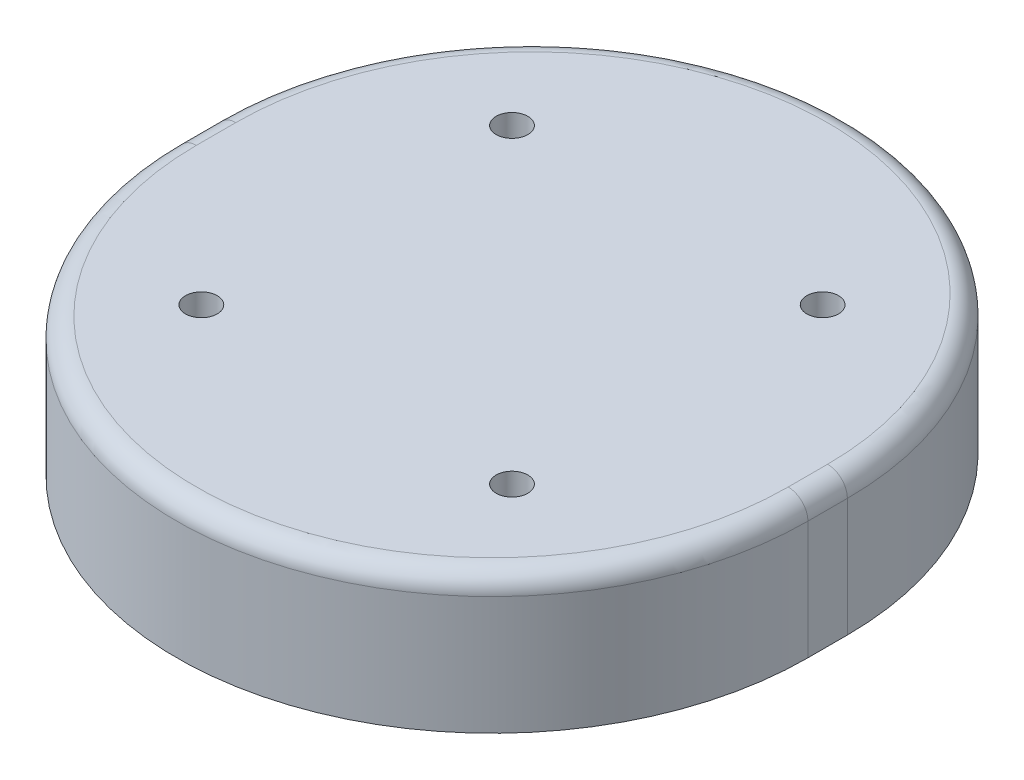
ISO-10303-21;
HEADER;
FILE_DESCRIPTION(('STEP AP214'),'2;1');
FILE_NAME('part.step','',(''),(''),'','','');
FILE_SCHEMA(('AUTOMOTIVE_DESIGN { 1 0 10303 214 1 1 1 1 }'));
ENDSEC;
DATA;
#1=APPLICATION_CONTEXT('core data for automotive mechanical design processes');
#2=APPLICATION_PROTOCOL_DEFINITION('international standard','automotive_design',2000,#1);
#3=PRODUCT_CONTEXT('',#1,'mechanical');
#4=PRODUCT('Part','Part','',(#3));
#5=PRODUCT_RELATED_PRODUCT_CATEGORY('part','',(#4));
#6=PRODUCT_DEFINITION_FORMATION('','',#4);
#7=PRODUCT_DEFINITION_CONTEXT('part definition',#1,'design');
#8=PRODUCT_DEFINITION('design','',#6,#7);
#9=PRODUCT_DEFINITION_SHAPE('','',#8);
#10=(LENGTH_UNIT() NAMED_UNIT(*) SI_UNIT(.MILLI.,.METRE.));
#11=(NAMED_UNIT(*) PLANE_ANGLE_UNIT() SI_UNIT($,.RADIAN.));
#12=(NAMED_UNIT(*) SI_UNIT($,.STERADIAN.) SOLID_ANGLE_UNIT());
#13=UNCERTAINTY_MEASURE_WITH_UNIT(LENGTH_MEASURE(1.E-05),#10,'distance_accuracy_value','');
#14=(GEOMETRIC_REPRESENTATION_CONTEXT(3) GLOBAL_UNCERTAINTY_ASSIGNED_CONTEXT((#13)) GLOBAL_UNIT_ASSIGNED_CONTEXT((#10,
#11,#12)) REPRESENTATION_CONTEXT('',''));
#15=CARTESIAN_POINT('',(0.,0.,0.));
#16=DIRECTION('',(0.,0.,1.));
#17=DIRECTION('',(1.,0.,0.));
#18=AXIS2_PLACEMENT_3D('',#15,#16,#17);
#19=CARTESIAN_POINT('',(0.,22.225,-3.17499999999998));
#20=DIRECTION('',(0.,-1.,0.));
#21=DIRECTION('',(0.,0.,-1.));
#22=AXIS2_PLACEMENT_3D('',#19,#20,#21);
#23=CYLINDRICAL_SURFACE('',#22,50.8);
#24=DIRECTION('',(0.,-1.,0.));
#25=VECTOR('',#24,1.);
#26=CARTESIAN_POINT('',(-50.8,22.225,-3.175));
#27=LINE('',#26,#25);
#28=CARTESIAN_POINT('',(-50.8,19.05,-3.175));
#29=VERTEX_POINT('',#28);
#30=CARTESIAN_POINT('',(-50.8,0.,-3.175));
#31=VERTEX_POINT('',#30);
#32=EDGE_CURVE('E181',#29,#31,#27,.T.);
#33=ORIENTED_EDGE('',*,*,#32,.F.);
#34=CARTESIAN_POINT('',(0.,19.05,-3.17499999999998));
#35=DIRECTION('',(0.,1.,0.));
#36=DIRECTION('',(0.,0.,1.));
#37=AXIS2_PLACEMENT_3D('',#34,#35,#36);
#38=CIRCLE('',#37,50.8);
#39=CARTESIAN_POINT('',(50.8,19.05,-3.175));
#40=VERTEX_POINT('',#39);
#41=EDGE_CURVE('E11',#29,#40,#38,.F.);
#42=ORIENTED_EDGE('',*,*,#41,.T.);
#43=DIRECTION('',(0.,-1.,0.));
#44=VECTOR('',#43,1.);
#45=CARTESIAN_POINT('',(50.8,22.225,-3.175));
#46=LINE('',#45,#44);
#47=CARTESIAN_POINT('',(50.8,0.,-3.175));
#48=VERTEX_POINT('',#47);
#49=EDGE_CURVE('E172',#40,#48,#46,.T.);
#50=ORIENTED_EDGE('',*,*,#49,.T.);
#51=CARTESIAN_POINT('',(0.,0.,-3.17499999999998));
#52=DIRECTION('',(0.,1.,0.));
#53=DIRECTION('',(0.,0.,1.));
#54=AXIS2_PLACEMENT_3D('',#51,#52,#53);
#55=CIRCLE('',#54,50.8);
#56=EDGE_CURVE('E156',#48,#31,#55,.T.);
#57=ORIENTED_EDGE('',*,*,#56,.T.);
#58=EDGE_LOOP('',(#33,#42,#50,#57));
#59=FACE_BOUND('',#58,.T.);
#60=ADVANCED_FACE('F49',(#59),#23,.T.);
#61=CARTESIAN_POINT('',(-50.8,22.225,-3.175));
#62=DIRECTION('',(1.,0.,0.));
#63=DIRECTION('',(0.,0.,-1.));
#64=AXIS2_PLACEMENT_3D('',#61,#62,#63);
#65=PLANE('',#64);
#66=DIRECTION('',(0.,-1.,0.));
#67=VECTOR('',#66,1.);
#68=CARTESIAN_POINT('',(-50.8,22.225,3.17499999999997));
#69=LINE('',#68,#67);
#70=CARTESIAN_POINT('',(-50.8,19.05,3.17499999999997));
#71=VERTEX_POINT('',#70);
#72=CARTESIAN_POINT('',(-50.8,0.,3.17499999999997));
#73=VERTEX_POINT('',#72);
#74=EDGE_CURVE('E178',#71,#73,#69,.T.);
#75=ORIENTED_EDGE('',*,*,#74,.F.);
#76=DIRECTION('',(0.,0.,1.));
#77=VECTOR('',#76,1.);
#78=CARTESIAN_POINT('',(-50.8,19.05,-3.175));
#79=LINE('',#78,#77);
#80=EDGE_CURVE('E59',#71,#29,#79,.F.);
#81=ORIENTED_EDGE('',*,*,#80,.T.);
#82=ORIENTED_EDGE('',*,*,#32,.T.);
#83=DIRECTION('',(0.,0.,1.));
#84=VECTOR('',#83,1.);
#85=CARTESIAN_POINT('',(-50.8,0.,-3.175));
#86=LINE('',#85,#84);
#87=EDGE_CURVE('E160',#31,#73,#86,.T.);
#88=ORIENTED_EDGE('',*,*,#87,.T.);
#89=EDGE_LOOP('',(#75,#81,#82,#88));
#90=FACE_BOUND('',#89,.T.);
#91=ADVANCED_FACE('F273',(#90),#65,.F.);
#92=CARTESIAN_POINT('',(0.,22.225,3.17499999999998));
#93=DIRECTION('',(0.,-1.,0.));
#94=DIRECTION('',(0.,0.,-1.));
#95=AXIS2_PLACEMENT_3D('',#92,#93,#94);
#96=CYLINDRICAL_SURFACE('',#95,50.8);
#97=DIRECTION('',(0.,-1.,0.));
#98=VECTOR('',#97,1.);
#99=CARTESIAN_POINT('',(50.8,22.225,3.175));
#100=LINE('',#99,#98);
#101=CARTESIAN_POINT('',(50.8,19.05,3.175));
#102=VERTEX_POINT('',#101);
#103=CARTESIAN_POINT('',(50.8,0.,3.175));
#104=VERTEX_POINT('',#103);
#105=EDGE_CURVE('E175',#102,#104,#100,.T.);
#106=ORIENTED_EDGE('',*,*,#105,.F.);
#107=CARTESIAN_POINT('',(0.,19.05,3.17499999999998));
#108=DIRECTION('',(0.,1.,0.));
#109=DIRECTION('',(0.,0.,1.));
#110=AXIS2_PLACEMENT_3D('',#107,#108,#109);
#111=CIRCLE('',#110,50.8);
#112=EDGE_CURVE('E74',#102,#71,#111,.F.);
#113=ORIENTED_EDGE('',*,*,#112,.T.);
#114=ORIENTED_EDGE('',*,*,#74,.T.);
#115=CARTESIAN_POINT('',(0.,0.,3.17499999999998));
#116=DIRECTION('',(0.,1.,0.));
#117=DIRECTION('',(0.,0.,1.));
#118=AXIS2_PLACEMENT_3D('',#115,#116,#117);
#119=CIRCLE('',#118,50.8);
#120=EDGE_CURVE('E164',#73,#104,#119,.T.);
#121=ORIENTED_EDGE('',*,*,#120,.T.);
#122=EDGE_LOOP('',(#106,#113,#114,#121));
#123=FACE_BOUND('',#122,.T.);
#124=ADVANCED_FACE('F279',(#123),#96,.T.);
#125=CARTESIAN_POINT('',(50.8,22.225,-3.175));
#126=DIRECTION('',(-1.,0.,0.));
#127=DIRECTION('',(0.,0.,1.));
#128=AXIS2_PLACEMENT_3D('',#125,#126,#127);
#129=PLANE('',#128);
#130=ORIENTED_EDGE('',*,*,#49,.F.);
#131=DIRECTION('',(0.,0.,-1.));
#132=VECTOR('',#131,1.);
#133=CARTESIAN_POINT('',(50.8,19.05,3.175));
#134=LINE('',#133,#132);
#135=EDGE_CURVE('E197',#40,#102,#134,.F.);
#136=ORIENTED_EDGE('',*,*,#135,.T.);
#137=ORIENTED_EDGE('',*,*,#105,.T.);
#138=DIRECTION('',(0.,0.,-1.));
#139=VECTOR('',#138,1.);
#140=CARTESIAN_POINT('',(50.8,0.,-3.175));
#141=LINE('',#140,#139);
#142=EDGE_CURVE('E168',#104,#48,#141,.T.);
#143=ORIENTED_EDGE('',*,*,#142,.T.);
#144=EDGE_LOOP('',(#130,#136,#137,#143));
#145=FACE_BOUND('',#144,.T.);
#146=ADVANCED_FACE('F234',(#145),#129,.F.);
#147=CARTESIAN_POINT('',(0.,22.225,-3.17499999999998));
#148=DIRECTION('',(0.,1.,0.));
#149=DIRECTION('',(0.,0.,1.));
#150=AXIS2_PLACEMENT_3D('',#147,#148,#149);
#151=PLANE('',#150);
#152=CARTESIAN_POINT('',(0.,22.225,3.17499999999998));
#153=DIRECTION('',(0.,1.,0.));
#154=DIRECTION('',(0.,0.,1.));
#155=AXIS2_PLACEMENT_3D('',#152,#153,#154);
#156=CIRCLE('',#155,47.625);
#157=CARTESIAN_POINT('',(-47.625,22.225,3.17499999999997));
#158=VERTEX_POINT('',#157);
#159=CARTESIAN_POINT('',(47.625,22.225,3.175));
#160=VERTEX_POINT('',#159);
#161=EDGE_CURVE('E190',#158,#160,#156,.T.);
#162=ORIENTED_EDGE('',*,*,#161,.T.);
#163=DIRECTION('',(0.,0.,-1.));
#164=VECTOR('',#163,1.);
#165=CARTESIAN_POINT('',(47.625,22.225,-3.175));
#166=LINE('',#165,#164);
#167=CARTESIAN_POINT('',(47.625,22.225,-3.175));
#168=VERTEX_POINT('',#167);
#169=EDGE_CURVE('E193',#160,#168,#166,.T.);
#170=ORIENTED_EDGE('',*,*,#169,.T.);
#171=CARTESIAN_POINT('',(0.,22.225,-3.17499999999998));
#172=DIRECTION('',(0.,1.,0.));
#173=DIRECTION('',(0.,0.,1.));
#174=AXIS2_PLACEMENT_3D('',#171,#172,#173);
#175=CIRCLE('',#174,47.625);
#176=CARTESIAN_POINT('',(-47.625,22.225,-3.175));
#177=VERTEX_POINT('',#176);
#178=EDGE_CURVE('E184',#168,#177,#175,.T.);
#179=ORIENTED_EDGE('',*,*,#178,.T.);
#180=DIRECTION('',(0.,0.,1.));
#181=VECTOR('',#180,1.);
#182=CARTESIAN_POINT('',(-47.625,22.225,3.17499999999997));
#183=LINE('',#182,#181);
#184=EDGE_CURVE('E187',#177,#158,#183,.T.);
#185=ORIENTED_EDGE('',*,*,#184,.T.);
#186=EDGE_LOOP('',(#162,#170,#179,#185));
#187=FACE_BOUND('',#186,.T.);
#188=CARTESIAN_POINT('',(-24.99995,22.225,-24.99995));
#189=DIRECTION('',(0.,1.,0.));
#190=DIRECTION('',(0.,0.,1.));
#191=AXIS2_PLACEMENT_3D('',#188,#189,#190);
#192=CIRCLE('',#191,2.55269999999999);
#193=CARTESIAN_POINT('',(-24.99995,22.225,-22.44725));
#194=VERTEX_POINT('',#193);
#195=EDGE_CURVE('E126',#194,#194,#192,.T.);
#196=ORIENTED_EDGE('',*,*,#195,.F.);
#197=EDGE_LOOP('',(#196));
#198=FACE_BOUND('',#197,.T.);
#199=CARTESIAN_POINT('',(24.99995,22.225,-24.9999500000014));
#200=DIRECTION('',(0.,1.,0.));
#201=DIRECTION('',(0.,0.,1.));
#202=AXIS2_PLACEMENT_3D('',#199,#200,#201);
#203=CIRCLE('',#202,2.55269999999999);
#204=CARTESIAN_POINT('',(24.99995,22.225,-22.4472500000014));
#205=VERTEX_POINT('',#204);
#206=EDGE_CURVE('E125',#205,#205,#203,.T.);
#207=ORIENTED_EDGE('',*,*,#206,.F.);
#208=EDGE_LOOP('',(#207));
#209=FACE_BOUND('',#208,.T.);
#210=CARTESIAN_POINT('',(24.9999500000014,22.225,24.9999499999986));
#211=DIRECTION('',(0.,1.,0.));
#212=DIRECTION('',(0.,0.,1.));
#213=AXIS2_PLACEMENT_3D('',#210,#211,#212);
#214=CIRCLE('',#213,2.55269999999999);
#215=CARTESIAN_POINT('',(24.9999500000014,22.225,27.5526499999986));
#216=VERTEX_POINT('',#215);
#217=EDGE_CURVE('E140',#216,#216,#214,.T.);
#218=ORIENTED_EDGE('',*,*,#217,.F.);
#219=EDGE_LOOP('',(#218));
#220=FACE_BOUND('',#219,.T.);
#221=CARTESIAN_POINT('',(-24.9999499999986,22.225,24.99995));
#222=DIRECTION('',(0.,1.,0.));
#223=DIRECTION('',(0.,0.,1.));
#224=AXIS2_PLACEMENT_3D('',#221,#222,#223);
#225=CIRCLE('',#224,2.55269999999999);
#226=CARTESIAN_POINT('',(-24.9999499999986,22.225,27.55265));
#227=VERTEX_POINT('',#226);
#228=EDGE_CURVE('E148',#227,#227,#225,.T.);
#229=ORIENTED_EDGE('',*,*,#228,.F.);
#230=EDGE_LOOP('',(#229));
#231=FACE_BOUND('',#230,.T.);
#232=ADVANCED_FACE('F241',(#187,#198,#209,#220,#231),#151,.T.);
#233=CARTESIAN_POINT('',(0.,0.,-3.17499999999998));
#234=DIRECTION('',(0.,1.,0.));
#235=DIRECTION('',(0.,0.,1.));
#236=AXIS2_PLACEMENT_3D('',#233,#234,#235);
#237=PLANE('',#236);
#238=ORIENTED_EDGE('',*,*,#56,.F.);
#239=ORIENTED_EDGE('',*,*,#142,.F.);
#240=ORIENTED_EDGE('',*,*,#120,.F.);
#241=ORIENTED_EDGE('',*,*,#87,.F.);
#242=EDGE_LOOP('',(#238,#239,#240,#241));
#243=FACE_BOUND('',#242,.T.);
#244=ADVANCED_FACE('F244',(#243),#237,.F.);
#245=CARTESIAN_POINT('',(-24.9999499999986,9.525,24.99995));
#246=DIRECTION('',(0.,1.,0.));
#247=DIRECTION('',(0.,0.,1.));
#248=AXIS2_PLACEMENT_3D('',#245,#246,#247);
#249=CONICAL_SURFACE('',#248,2.5527,1.02974425867665);
#250=CARTESIAN_POINT('',(-24.9999499999986,7.99118309780835,24.99995));
#251=VERTEX_POINT('',#250);
#252=VERTEX_LOOP('',#251);
#253=FACE_BOUND('',#252,.T.);
#254=CARTESIAN_POINT('',(-24.9999499999986,9.525,24.99995));
#255=DIRECTION('',(0.,1.,0.));
#256=DIRECTION('',(0.,0.,1.));
#257=AXIS2_PLACEMENT_3D('',#254,#255,#256);
#258=CIRCLE('',#257,2.5527);
#259=CARTESIAN_POINT('',(-24.9999499999986,9.525,27.55265));
#260=VERTEX_POINT('',#259);
#261=EDGE_CURVE('E152',#260,#260,#258,.T.);
#262=ORIENTED_EDGE('',*,*,#261,.T.);
#263=EDGE_LOOP('',(#262));
#264=FACE_BOUND('',#263,.T.);
#265=ADVANCED_FACE('F257',(#253,#264),#249,.F.);
#266=CARTESIAN_POINT('',(-24.9999499999986,22.225,24.99995));
#267=DIRECTION('',(0.,1.,0.));
#268=DIRECTION('',(0.,0.,1.));
#269=AXIS2_PLACEMENT_3D('',#266,#267,#268);
#270=CYLINDRICAL_SURFACE('',#269,2.55269999999999);
#271=ORIENTED_EDGE('',*,*,#261,.F.);
#272=EDGE_LOOP('',(#271));
#273=FACE_BOUND('',#272,.T.);
#274=ORIENTED_EDGE('',*,*,#228,.T.);
#275=EDGE_LOOP('',(#274));
#276=FACE_BOUND('',#275,.T.);
#277=ADVANCED_FACE('F254',(#273,#276),#270,.F.);
#278=CARTESIAN_POINT('',(24.9999500000014,9.525,24.9999499999986));
#279=DIRECTION('',(0.,1.,0.));
#280=DIRECTION('',(0.,0.,1.));
#281=AXIS2_PLACEMENT_3D('',#278,#279,#280);
#282=CONICAL_SURFACE('',#281,2.5527,1.02974425867665);
#283=CARTESIAN_POINT('',(24.9999500000014,7.99118309780835,24.9999499999986));
#284=VERTEX_POINT('',#283);
#285=VERTEX_LOOP('',#284);
#286=FACE_BOUND('',#285,.T.);
#287=CARTESIAN_POINT('',(24.9999500000014,9.525,24.9999499999986));
#288=DIRECTION('',(0.,1.,0.));
#289=DIRECTION('',(0.,0.,1.));
#290=AXIS2_PLACEMENT_3D('',#287,#288,#289);
#291=CIRCLE('',#290,2.5527);
#292=CARTESIAN_POINT('',(24.9999500000014,9.525,27.5526499999986));
#293=VERTEX_POINT('',#292);
#294=EDGE_CURVE('E144',#293,#293,#291,.T.);
#295=ORIENTED_EDGE('',*,*,#294,.T.);
#296=EDGE_LOOP('',(#295));
#297=FACE_BOUND('',#296,.T.);
#298=ADVANCED_FACE('F256',(#286,#297),#282,.F.);
#299=CARTESIAN_POINT('',(24.9999500000014,22.225,24.9999499999986));
#300=DIRECTION('',(0.,1.,0.));
#301=DIRECTION('',(0.,0.,1.));
#302=AXIS2_PLACEMENT_3D('',#299,#300,#301);
#303=CYLINDRICAL_SURFACE('',#302,2.55269999999999);
#304=ORIENTED_EDGE('',*,*,#294,.F.);
#305=EDGE_LOOP('',(#304));
#306=FACE_BOUND('',#305,.T.);
#307=ORIENTED_EDGE('',*,*,#217,.T.);
#308=EDGE_LOOP('',(#307));
#309=FACE_BOUND('',#308,.T.);
#310=ADVANCED_FACE('F265',(#306,#309),#303,.F.);
#311=CARTESIAN_POINT('',(24.99995,9.525,-24.9999500000014));
#312=DIRECTION('',(0.,1.,0.));
#313=DIRECTION('',(0.,0.,1.));
#314=AXIS2_PLACEMENT_3D('',#311,#312,#313);
#315=CONICAL_SURFACE('',#314,2.5527,1.02974425867665);
#316=CARTESIAN_POINT('',(24.99995,7.99118309780835,-24.9999500000014));
#317=VERTEX_POINT('',#316);
#318=VERTEX_LOOP('',#317);
#319=FACE_BOUND('',#318,.T.);
#320=CARTESIAN_POINT('',(24.99995,9.525,-24.9999500000014));
#321=DIRECTION('',(0.,1.,0.));
#322=DIRECTION('',(0.,0.,1.));
#323=AXIS2_PLACEMENT_3D('',#320,#321,#322);
#324=CIRCLE('',#323,2.5527);
#325=CARTESIAN_POINT('',(24.99995,9.525,-22.4472500000014));
#326=VERTEX_POINT('',#325);
#327=EDGE_CURVE('E132',#326,#326,#324,.T.);
#328=ORIENTED_EDGE('',*,*,#327,.T.);
#329=EDGE_LOOP('',(#328));
#330=FACE_BOUND('',#329,.T.);
#331=ADVANCED_FACE('F300',(#319,#330),#315,.F.);
#332=CARTESIAN_POINT('',(24.99995,22.225,-24.9999500000014));
#333=DIRECTION('',(0.,1.,0.));
#334=DIRECTION('',(0.,0.,1.));
#335=AXIS2_PLACEMENT_3D('',#332,#333,#334);
#336=CYLINDRICAL_SURFACE('',#335,2.55269999999999);
#337=ORIENTED_EDGE('',*,*,#327,.F.);
#338=EDGE_LOOP('',(#337));
#339=FACE_BOUND('',#338,.T.);
#340=ORIENTED_EDGE('',*,*,#206,.T.);
#341=EDGE_LOOP('',(#340));
#342=FACE_BOUND('',#341,.T.);
#343=ADVANCED_FACE('F118',(#339,#342),#336,.F.);
#344=CARTESIAN_POINT('',(-24.99995,9.525,-24.99995));
#345=DIRECTION('',(0.,1.,0.));
#346=DIRECTION('',(0.,0.,1.));
#347=AXIS2_PLACEMENT_3D('',#344,#345,#346);
#348=CONICAL_SURFACE('',#347,2.5527,1.02974425867665);
#349=CARTESIAN_POINT('',(-24.99995,7.99118309780835,-24.99995));
#350=VERTEX_POINT('',#349);
#351=VERTEX_LOOP('',#350);
#352=FACE_BOUND('',#351,.T.);
#353=CARTESIAN_POINT('',(-24.99995,9.525,-24.99995));
#354=DIRECTION('',(0.,1.,0.));
#355=DIRECTION('',(0.,0.,1.));
#356=AXIS2_PLACEMENT_3D('',#353,#354,#355);
#357=CIRCLE('',#356,2.5527);
#358=CARTESIAN_POINT('',(-24.99995,9.525,-22.44725));
#359=VERTEX_POINT('',#358);
#360=EDGE_CURVE('E122',#359,#359,#357,.T.);
#361=ORIENTED_EDGE('',*,*,#360,.T.);
#362=EDGE_LOOP('',(#361));
#363=FACE_BOUND('',#362,.T.);
#364=ADVANCED_FACE('F114',(#352,#363),#348,.F.);
#365=CARTESIAN_POINT('',(-24.99995,22.225,-24.99995));
#366=DIRECTION('',(0.,1.,0.));
#367=DIRECTION('',(0.,0.,1.));
#368=AXIS2_PLACEMENT_3D('',#365,#366,#367);
#369=CYLINDRICAL_SURFACE('',#368,2.55269999999999);
#370=ORIENTED_EDGE('',*,*,#360,.F.);
#371=EDGE_LOOP('',(#370));
#372=FACE_BOUND('',#371,.T.);
#373=ORIENTED_EDGE('',*,*,#195,.T.);
#374=EDGE_LOOP('',(#373));
#375=FACE_BOUND('',#374,.T.);
#376=ADVANCED_FACE('F117',(#372,#375),#369,.F.);
#377=CARTESIAN_POINT('',(-47.625,19.05,-3.17499999999998));
#378=DIRECTION('',(0.,0.,-1.));
#379=DIRECTION('',(-1.,0.,0.));
#380=AXIS2_PLACEMENT_3D('',#377,#378,#379);
#381=CYLINDRICAL_SURFACE('',#380,3.175);
#382=CARTESIAN_POINT('',(-47.625,19.05,-3.175));
#383=DIRECTION('',(0.,0.,-1.));
#384=DIRECTION('',(-1.,0.,0.));
#385=AXIS2_PLACEMENT_3D('',#382,#383,#384);
#386=CIRCLE('',#385,3.175);
#387=EDGE_CURVE('E210',#29,#177,#386,.T.);
#388=ORIENTED_EDGE('',*,*,#387,.F.);
#389=ORIENTED_EDGE('',*,*,#80,.F.);
#390=CARTESIAN_POINT('',(-47.625,19.05,3.17499999999997));
#391=DIRECTION('',(0.,0.,1.));
#392=DIRECTION('',(1.,0.,0.));
#393=AXIS2_PLACEMENT_3D('',#390,#391,#392);
#394=CIRCLE('',#393,3.175);
#395=EDGE_CURVE('E53',#158,#71,#394,.T.);
#396=ORIENTED_EDGE('',*,*,#395,.F.);
#397=ORIENTED_EDGE('',*,*,#184,.F.);
#398=EDGE_LOOP('',(#388,#389,#396,#397));
#399=FACE_BOUND('',#398,.T.);
#400=ADVANCED_FACE('F51',(#399),#381,.T.);
#401=CARTESIAN_POINT('',(0.,19.05,3.17499999999998));
#402=DIRECTION('',(0.,1.,0.));
#403=DIRECTION('',(0.,0.,1.));
#404=AXIS2_PLACEMENT_3D('',#401,#402,#403);
#405=TOROIDAL_SURFACE('',#404,47.625,3.175);
#406=ORIENTED_EDGE('',*,*,#395,.T.);
#407=ORIENTED_EDGE('',*,*,#112,.F.);
#408=CARTESIAN_POINT('',(47.625,19.05,3.175));
#409=DIRECTION('',(0.,0.,-1.));
#410=DIRECTION('',(-1.,0.,0.));
#411=AXIS2_PLACEMENT_3D('',#408,#409,#410);
#412=CIRCLE('',#411,3.175);
#413=EDGE_CURVE('E208',#160,#102,#412,.T.);
#414=ORIENTED_EDGE('',*,*,#413,.F.);
#415=ORIENTED_EDGE('',*,*,#161,.F.);
#416=EDGE_LOOP('',(#406,#407,#414,#415));
#417=FACE_BOUND('',#416,.T.);
#418=ADVANCED_FACE('F224',(#417),#405,.T.);
#419=CARTESIAN_POINT('',(0.,19.05,-3.17499999999998));
#420=DIRECTION('',(0.,1.,0.));
#421=DIRECTION('',(0.,0.,1.));
#422=AXIS2_PLACEMENT_3D('',#419,#420,#421);
#423=TOROIDAL_SURFACE('',#422,47.625,3.175);
#424=ORIENTED_EDGE('',*,*,#387,.T.);
#425=ORIENTED_EDGE('',*,*,#178,.F.);
#426=CARTESIAN_POINT('',(47.625,19.05,-3.175));
#427=DIRECTION('',(0.,0.,1.));
#428=DIRECTION('',(1.,0.,0.));
#429=AXIS2_PLACEMENT_3D('',#426,#427,#428);
#430=CIRCLE('',#429,3.175);
#431=EDGE_CURVE('E205',#40,#168,#430,.T.);
#432=ORIENTED_EDGE('',*,*,#431,.F.);
#433=ORIENTED_EDGE('',*,*,#41,.F.);
#434=EDGE_LOOP('',(#424,#425,#432,#433));
#435=FACE_BOUND('',#434,.T.);
#436=ADVANCED_FACE('F229',(#435),#423,.T.);
#437=CARTESIAN_POINT('',(47.625,19.05,-3.17499999999998));
#438=DIRECTION('',(0.,0.,1.));
#439=DIRECTION('',(1.,0.,0.));
#440=AXIS2_PLACEMENT_3D('',#437,#438,#439);
#441=CYLINDRICAL_SURFACE('',#440,3.175);
#442=ORIENTED_EDGE('',*,*,#413,.T.);
#443=ORIENTED_EDGE('',*,*,#135,.F.);
#444=ORIENTED_EDGE('',*,*,#431,.T.);
#445=ORIENTED_EDGE('',*,*,#169,.F.);
#446=EDGE_LOOP('',(#442,#443,#444,#445));
#447=FACE_BOUND('',#446,.T.);
#448=ADVANCED_FACE('F238',(#447),#441,.T.);
#449=CLOSED_SHELL('',(#60,#91,#124,#146,#232,#244,#265,#277,#298,#310,#331,#343,#364,#376,#400,
#418,#436,#448));
#450=MANIFOLD_SOLID_BREP('B2',#449);
#451=ADVANCED_BREP_SHAPE_REPRESENTATION('',(#18,#450),#14);
#452=SHAPE_DEFINITION_REPRESENTATION(#9,#451);
ENDSEC;
END-ISO-10303-21;
